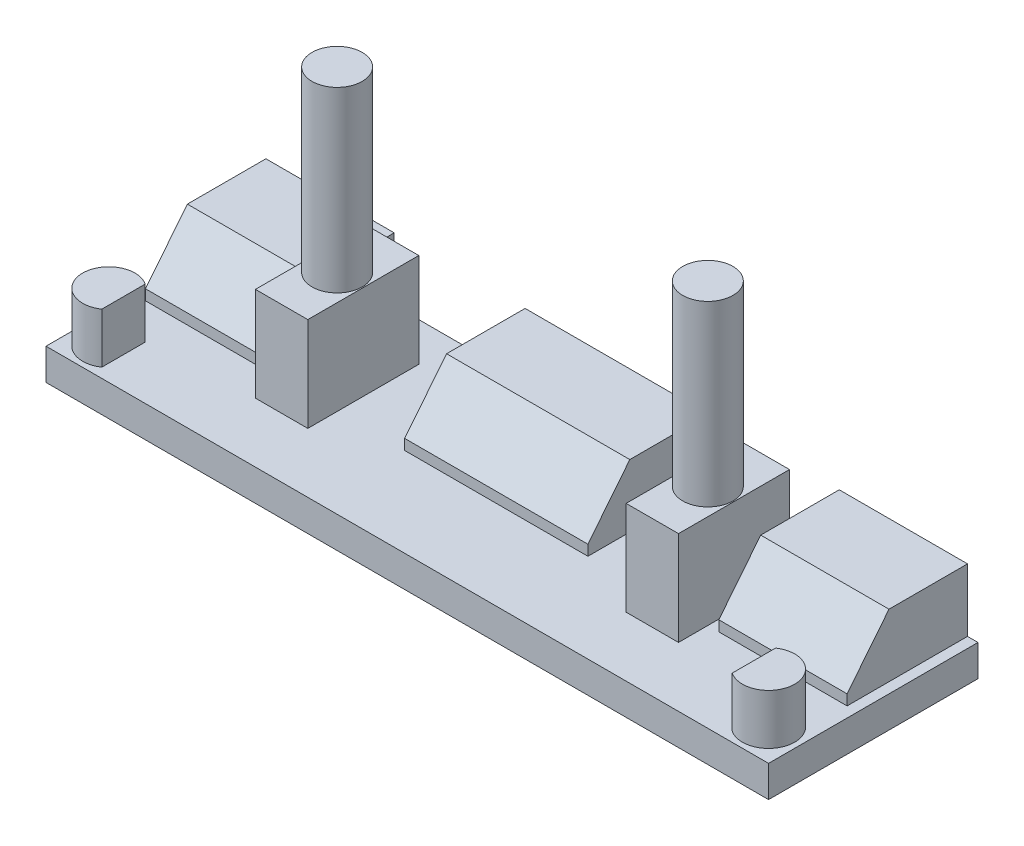
ISO-10303-21;
HEADER;
FILE_DESCRIPTION(('STEP AP214'),'2;1');
FILE_NAME('part.step','',(''),(''),'','','');
FILE_SCHEMA(('AUTOMOTIVE_DESIGN { 1 0 10303 214 1 1 1 1 }'));
ENDSEC;
DATA;
#1=APPLICATION_CONTEXT('core data for automotive mechanical design processes');
#2=APPLICATION_PROTOCOL_DEFINITION('international standard','automotive_design',2000,#1);
#3=PRODUCT_CONTEXT('',#1,'mechanical');
#4=PRODUCT('Part','Part','',(#3));
#5=PRODUCT_RELATED_PRODUCT_CATEGORY('part','',(#4));
#6=PRODUCT_DEFINITION_FORMATION('','',#4);
#7=PRODUCT_DEFINITION_CONTEXT('part definition',#1,'design');
#8=PRODUCT_DEFINITION('design','',#6,#7);
#9=PRODUCT_DEFINITION_SHAPE('','',#8);
#10=(LENGTH_UNIT() NAMED_UNIT(*) SI_UNIT(.MILLI.,.METRE.));
#11=(NAMED_UNIT(*) PLANE_ANGLE_UNIT() SI_UNIT($,.RADIAN.));
#12=(NAMED_UNIT(*) SI_UNIT($,.STERADIAN.) SOLID_ANGLE_UNIT());
#13=UNCERTAINTY_MEASURE_WITH_UNIT(LENGTH_MEASURE(1.E-05),#10,'distance_accuracy_value','');
#14=(GEOMETRIC_REPRESENTATION_CONTEXT(3) GLOBAL_UNCERTAINTY_ASSIGNED_CONTEXT((#13)) GLOBAL_UNIT_ASSIGNED_CONTEXT((#10,
#11,#12)) REPRESENTATION_CONTEXT('',''));
#15=CARTESIAN_POINT('',(0.,0.,0.));
#16=DIRECTION('',(0.,0.,1.));
#17=DIRECTION('',(1.,0.,0.));
#18=AXIS2_PLACEMENT_3D('',#15,#16,#17);
#19=CARTESIAN_POINT('',(0.,3.,0.));
#20=DIRECTION('',(1.,0.,0.));
#21=DIRECTION('',(0.,0.,-1.));
#22=AXIS2_PLACEMENT_3D('',#19,#20,#21);
#23=PLANE('',#22);
#24=DIRECTION('',(0.,0.,1.));
#25=VECTOR('',#24,1.);
#26=CARTESIAN_POINT('',(0.,3.,0.));
#27=LINE('',#26,#25);
#28=CARTESIAN_POINT('',(0.,3.,-20.));
#29=VERTEX_POINT('',#28);
#30=CARTESIAN_POINT('',(0.,3.,0.));
#31=VERTEX_POINT('',#30);
#32=EDGE_CURVE('E509',#29,#31,#27,.T.);
#33=ORIENTED_EDGE('',*,*,#32,.T.);
#34=DIRECTION('',(0.,1.,0.));
#35=VECTOR('',#34,1.);
#36=CARTESIAN_POINT('',(0.,3.,0.));
#37=LINE('',#36,#35);
#38=CARTESIAN_POINT('',(0.,6.,0.));
#39=VERTEX_POINT('',#38);
#40=EDGE_CURVE('E521',#31,#39,#37,.T.);
#41=ORIENTED_EDGE('',*,*,#40,.T.);
#42=DIRECTION('',(0.,0.,1.));
#43=VECTOR('',#42,1.);
#44=CARTESIAN_POINT('',(0.,6.,0.));
#45=LINE('',#44,#43);
#46=CARTESIAN_POINT('',(0.,6.,-20.));
#47=VERTEX_POINT('',#46);
#48=EDGE_CURVE('E508',#47,#39,#45,.T.);
#49=ORIENTED_EDGE('',*,*,#48,.F.);
#50=DIRECTION('',(0.,1.,0.));
#51=VECTOR('',#50,1.);
#52=CARTESIAN_POINT('',(0.,3.,-20.));
#53=LINE('',#52,#51);
#54=EDGE_CURVE('E545',#29,#47,#53,.T.);
#55=ORIENTED_EDGE('',*,*,#54,.F.);
#56=EDGE_LOOP('',(#33,#41,#49,#55));
#57=FACE_BOUND('',#56,.T.);
#58=ADVANCED_FACE('F42',(#57),#23,.F.);
#59=CARTESIAN_POINT('',(0.,3.,0.));
#60=DIRECTION('',(0.,0.,-1.));
#61=DIRECTION('',(-1.,0.,0.));
#62=AXIS2_PLACEMENT_3D('',#59,#60,#61);
#63=PLANE('',#62);
#64=DIRECTION('',(1.,0.,0.));
#65=VECTOR('',#64,1.);
#66=CARTESIAN_POINT('',(0.,3.,0.));
#67=LINE('',#66,#65);
#68=CARTESIAN_POINT('',(69.,3.,0.));
#69=VERTEX_POINT('',#68);
#70=EDGE_CURVE('E519',#31,#69,#67,.T.);
#71=ORIENTED_EDGE('',*,*,#70,.T.);
#72=DIRECTION('',(0.,1.,0.));
#73=VECTOR('',#72,1.);
#74=CARTESIAN_POINT('',(69.,3.,0.));
#75=LINE('',#74,#73);
#76=CARTESIAN_POINT('',(69.,6.,0.));
#77=VERTEX_POINT('',#76);
#78=EDGE_CURVE('E539',#69,#77,#75,.T.);
#79=ORIENTED_EDGE('',*,*,#78,.T.);
#80=DIRECTION('',(1.,0.,0.));
#81=VECTOR('',#80,1.);
#82=CARTESIAN_POINT('',(0.,6.,0.));
#83=LINE('',#82,#81);
#84=EDGE_CURVE('E513',#39,#77,#83,.T.);
#85=ORIENTED_EDGE('',*,*,#84,.F.);
#86=ORIENTED_EDGE('',*,*,#40,.F.);
#87=EDGE_LOOP('',(#71,#79,#85,#86));
#88=FACE_BOUND('',#87,.T.);
#89=ADVANCED_FACE('F620',(#88),#63,.F.);
#90=CARTESIAN_POINT('',(69.,3.,0.));
#91=DIRECTION('',(-1.,0.,0.));
#92=DIRECTION('',(0.,0.,1.));
#93=AXIS2_PLACEMENT_3D('',#90,#91,#92);
#94=PLANE('',#93);
#95=DIRECTION('',(0.,0.,-1.));
#96=VECTOR('',#95,1.);
#97=CARTESIAN_POINT('',(69.,3.,0.));
#98=LINE('',#97,#96);
#99=CARTESIAN_POINT('',(69.,3.,-20.));
#100=VERTEX_POINT('',#99);
#101=EDGE_CURVE('E516',#69,#100,#98,.T.);
#102=ORIENTED_EDGE('',*,*,#101,.T.);
#103=DIRECTION('',(0.,1.,0.));
#104=VECTOR('',#103,1.);
#105=CARTESIAN_POINT('',(69.,3.,-20.));
#106=LINE('',#105,#104);
#107=CARTESIAN_POINT('',(69.,6.,-20.));
#108=VERTEX_POINT('',#107);
#109=EDGE_CURVE('E542',#100,#108,#106,.T.);
#110=ORIENTED_EDGE('',*,*,#109,.T.);
#111=DIRECTION('',(0.,0.,-1.));
#112=VECTOR('',#111,1.);
#113=CARTESIAN_POINT('',(69.,6.,0.));
#114=LINE('',#113,#112);
#115=EDGE_CURVE('E529',#77,#108,#114,.T.);
#116=ORIENTED_EDGE('',*,*,#115,.F.);
#117=ORIENTED_EDGE('',*,*,#78,.F.);
#118=EDGE_LOOP('',(#102,#110,#116,#117));
#119=FACE_BOUND('',#118,.T.);
#120=ADVANCED_FACE('F626',(#119),#94,.F.);
#121=CARTESIAN_POINT('',(0.,3.,-20.));
#122=DIRECTION('',(0.,0.,1.));
#123=DIRECTION('',(1.,0.,0.));
#124=AXIS2_PLACEMENT_3D('',#121,#122,#123);
#125=PLANE('',#124);
#126=DIRECTION('',(-1.,0.,0.));
#127=VECTOR('',#126,1.);
#128=CARTESIAN_POINT('',(0.,3.,-20.));
#129=LINE('',#128,#127);
#130=EDGE_CURVE('E512',#100,#29,#129,.T.);
#131=ORIENTED_EDGE('',*,*,#130,.T.);
#132=ORIENTED_EDGE('',*,*,#54,.T.);
#133=DIRECTION('',(-1.,0.,0.));
#134=VECTOR('',#133,1.);
#135=CARTESIAN_POINT('',(0.,6.,-20.));
#136=LINE('',#135,#134);
#137=CARTESIAN_POINT('',(0.999999999999987,6.,-20.));
#138=VERTEX_POINT('',#137);
#139=EDGE_CURVE('E525',#138,#47,#136,.T.);
#140=ORIENTED_EDGE('',*,*,#139,.F.);
#141=DIRECTION('',(0.,-1.,0.));
#142=VECTOR('',#141,1.);
#143=CARTESIAN_POINT('',(0.999999999999987,12.,-20.));
#144=LINE('',#143,#142);
#145=CARTESIAN_POINT('',(0.999999999999987,12.,-20.));
#146=VERTEX_POINT('',#145);
#147=EDGE_CURVE('E501',#146,#138,#144,.T.);
#148=ORIENTED_EDGE('',*,*,#147,.F.);
#149=DIRECTION('',(1.,0.,0.));
#150=VECTOR('',#149,1.);
#151=CARTESIAN_POINT('',(13.25,12.,-20.));
#152=LINE('',#151,#150);
#153=CARTESIAN_POINT('',(13.25,12.,-20.));
#154=VERTEX_POINT('',#153);
#155=EDGE_CURVE('E477',#146,#154,#152,.T.);
#156=ORIENTED_EDGE('',*,*,#155,.T.);
#157=DIRECTION('',(0.,-1.,0.));
#158=VECTOR('',#157,1.);
#159=CARTESIAN_POINT('',(13.25,12.,-20.));
#160=LINE('',#159,#158);
#161=CARTESIAN_POINT('',(13.25,6.,-20.));
#162=VERTEX_POINT('',#161);
#163=EDGE_CURVE('E504',#154,#162,#160,.T.);
#164=ORIENTED_EDGE('',*,*,#163,.T.);
#165=CARTESIAN_POINT('',(25.75,6.,-20.));
#166=VERTEX_POINT('',#165);
#167=EDGE_CURVE('E607',#166,#162,#136,.T.);
#168=ORIENTED_EDGE('',*,*,#167,.F.);
#169=DIRECTION('',(0.,-1.,0.));
#170=VECTOR('',#169,1.);
#171=CARTESIAN_POINT('',(25.75,12.,-20.));
#172=LINE('',#171,#170);
#173=CARTESIAN_POINT('',(25.75,12.,-20.));
#174=VERTEX_POINT('',#173);
#175=EDGE_CURVE('E464',#174,#166,#172,.T.);
#176=ORIENTED_EDGE('',*,*,#175,.F.);
#177=DIRECTION('',(1.,0.,0.));
#178=VECTOR('',#177,1.);
#179=CARTESIAN_POINT('',(43.25,12.,-20.));
#180=LINE('',#179,#178);
#181=CARTESIAN_POINT('',(43.25,12.,-20.));
#182=VERTEX_POINT('',#181);
#183=EDGE_CURVE('E440',#174,#182,#180,.T.);
#184=ORIENTED_EDGE('',*,*,#183,.T.);
#185=DIRECTION('',(0.,-1.,0.));
#186=VECTOR('',#185,1.);
#187=CARTESIAN_POINT('',(43.25,12.,-20.));
#188=LINE('',#187,#186);
#189=CARTESIAN_POINT('',(43.25,6.,-20.));
#190=VERTEX_POINT('',#189);
#191=EDGE_CURVE('E468',#182,#190,#188,.T.);
#192=ORIENTED_EDGE('',*,*,#191,.T.);
#193=CARTESIAN_POINT('',(55.75,6.,-20.));
#194=VERTEX_POINT('',#193);
#195=EDGE_CURVE('E530',#194,#190,#136,.T.);
#196=ORIENTED_EDGE('',*,*,#195,.F.);
#197=DIRECTION('',(0.,-1.,0.));
#198=VECTOR('',#197,1.);
#199=CARTESIAN_POINT('',(55.75,12.,-20.));
#200=LINE('',#199,#198);
#201=CARTESIAN_POINT('',(55.75,12.,-20.));
#202=VERTEX_POINT('',#201);
#203=EDGE_CURVE('E411',#202,#194,#200,.T.);
#204=ORIENTED_EDGE('',*,*,#203,.F.);
#205=DIRECTION('',(1.,0.,0.));
#206=VECTOR('',#205,1.);
#207=CARTESIAN_POINT('',(55.75,12.,-20.));
#208=LINE('',#207,#206);
#209=CARTESIAN_POINT('',(68.,12.,-20.));
#210=VERTEX_POINT('',#209);
#211=EDGE_CURVE('E407',#202,#210,#208,.T.);
#212=ORIENTED_EDGE('',*,*,#211,.T.);
#213=DIRECTION('',(0.,-1.,0.));
#214=VECTOR('',#213,1.);
#215=CARTESIAN_POINT('',(68.,12.,-20.));
#216=LINE('',#215,#214);
#217=CARTESIAN_POINT('',(68.,6.,-20.));
#218=VERTEX_POINT('',#217);
#219=EDGE_CURVE('E425',#210,#218,#216,.T.);
#220=ORIENTED_EDGE('',*,*,#219,.T.);
#221=EDGE_CURVE('E526',#108,#218,#136,.T.);
#222=ORIENTED_EDGE('',*,*,#221,.F.);
#223=ORIENTED_EDGE('',*,*,#109,.F.);
#224=EDGE_LOOP('',(#131,#132,#140,#148,#156,#164,#168,#176,#184,#192,#196,#204,#212,#220,#222,#223));
#225=FACE_BOUND('',#224,.T.);
#226=ADVANCED_FACE('F612',(#225),#125,.F.);
#227=CARTESIAN_POINT('',(0.,6.,0.));
#228=DIRECTION('',(0.,1.,0.));
#229=DIRECTION('',(0.,0.,-1.));
#230=AXIS2_PLACEMENT_3D('',#227,#228,#229);
#231=PLANE('',#230);
#232=DIRECTION('',(0.,0.,-1.));
#233=VECTOR('',#232,1.);
#234=CARTESIAN_POINT('',(64.6,6.,0.));
#235=LINE('',#234,#233);
#236=CARTESIAN_POINT('',(64.6,6.,-0.928768482279194));
#237=VERTEX_POINT('',#236);
#238=CARTESIAN_POINT('',(64.6,6.,-5.07123151772079));
#239=VERTEX_POINT('',#238);
#240=EDGE_CURVE('E254',#237,#239,#235,.T.);
#241=ORIENTED_EDGE('',*,*,#240,.T.);
#242=CARTESIAN_POINT('',(66.,6.,-2.99999999999999));
#243=DIRECTION('',(0.,-1.,0.));
#244=DIRECTION('',(0.,0.,-1.));
#245=AXIS2_PLACEMENT_3D('',#242,#243,#244);
#246=CIRCLE('',#245,2.5);
#247=EDGE_CURVE('E58',#239,#237,#246,.T.);
#248=ORIENTED_EDGE('',*,*,#247,.T.);
#249=EDGE_LOOP('',(#241,#248));
#250=FACE_BOUND('',#249,.T.);
#251=DIRECTION('',(-1.,0.,0.));
#252=VECTOR('',#251,1.);
#253=CARTESIAN_POINT('',(19.3,6.,-5.70000000000001));
#254=LINE('',#253,#252);
#255=CARTESIAN_POINT('',(19.3,6.,-5.70000000000001));
#256=VERTEX_POINT('',#255);
#257=CARTESIAN_POINT('',(14.3,6.,-5.70000000000002));
#258=VERTEX_POINT('',#257);
#259=EDGE_CURVE('E307',#256,#258,#254,.T.);
#260=ORIENTED_EDGE('',*,*,#259,.T.);
#261=DIRECTION('',(0.,0.,-1.));
#262=VECTOR('',#261,1.);
#263=CARTESIAN_POINT('',(14.3,6.,-5.70000000000002));
#264=LINE('',#263,#262);
#265=CARTESIAN_POINT('',(14.3,6.,-16.3));
#266=VERTEX_POINT('',#265);
#267=EDGE_CURVE('E316',#258,#266,#264,.T.);
#268=ORIENTED_EDGE('',*,*,#267,.T.);
#269=DIRECTION('',(1.,0.,0.));
#270=VECTOR('',#269,1.);
#271=CARTESIAN_POINT('',(19.3,6.,-16.3));
#272=LINE('',#271,#270);
#273=CARTESIAN_POINT('',(19.3,6.,-16.3));
#274=VERTEX_POINT('',#273);
#275=EDGE_CURVE('E334',#266,#274,#272,.T.);
#276=ORIENTED_EDGE('',*,*,#275,.T.);
#277=DIRECTION('',(0.,0.,1.));
#278=VECTOR('',#277,1.);
#279=CARTESIAN_POINT('',(19.3,6.,-5.70000000000001));
#280=LINE('',#279,#278);
#281=EDGE_CURVE('E331',#274,#256,#280,.T.);
#282=ORIENTED_EDGE('',*,*,#281,.T.);
#283=EDGE_LOOP('',(#260,#268,#276,#282));
#284=FACE_BOUND('',#283,.T.);
#285=DIRECTION('',(0.,0.,-1.));
#286=VECTOR('',#285,1.);
#287=CARTESIAN_POINT('',(49.7,6.,-5.7));
#288=LINE('',#287,#286);
#289=CARTESIAN_POINT('',(49.7,6.,-5.7));
#290=VERTEX_POINT('',#289);
#291=CARTESIAN_POINT('',(49.7,6.,-16.3));
#292=VERTEX_POINT('',#291);
#293=EDGE_CURVE('E354',#290,#292,#288,.T.);
#294=ORIENTED_EDGE('',*,*,#293,.T.);
#295=DIRECTION('',(1.,0.,0.));
#296=VECTOR('',#295,1.);
#297=CARTESIAN_POINT('',(49.7,6.,-16.3));
#298=LINE('',#297,#296);
#299=CARTESIAN_POINT('',(54.7,6.,-16.3));
#300=VERTEX_POINT('',#299);
#301=EDGE_CURVE('E360',#292,#300,#298,.T.);
#302=ORIENTED_EDGE('',*,*,#301,.T.);
#303=DIRECTION('',(0.,0.,1.));
#304=VECTOR('',#303,1.);
#305=CARTESIAN_POINT('',(54.7,6.,-5.7));
#306=LINE('',#305,#304);
#307=CARTESIAN_POINT('',(54.7,6.,-5.7));
#308=VERTEX_POINT('',#307);
#309=EDGE_CURVE('E378',#300,#308,#306,.T.);
#310=ORIENTED_EDGE('',*,*,#309,.T.);
#311=DIRECTION('',(-1.,0.,0.));
#312=VECTOR('',#311,1.);
#313=CARTESIAN_POINT('',(49.7,6.,-5.7));
#314=LINE('',#313,#312);
#315=EDGE_CURVE('E375',#308,#290,#314,.T.);
#316=ORIENTED_EDGE('',*,*,#315,.T.);
#317=EDGE_LOOP('',(#294,#302,#310,#316));
#318=FACE_BOUND('',#317,.T.);
#319=DIRECTION('',(0.,0.,-1.));
#320=VECTOR('',#319,1.);
#321=CARTESIAN_POINT('',(55.75,6.,-20.));
#322=LINE('',#321,#320);
#323=CARTESIAN_POINT('',(55.75,6.,-8.5));
#324=VERTEX_POINT('',#323);
#325=EDGE_CURVE('E398',#324,#194,#322,.T.);
#326=ORIENTED_EDGE('',*,*,#325,.T.);
#327=ORIENTED_EDGE('',*,*,#195,.T.);
#328=DIRECTION('',(0.,0.,1.));
#329=VECTOR('',#328,1.);
#330=CARTESIAN_POINT('',(43.25,6.,-20.));
#331=LINE('',#330,#329);
#332=CARTESIAN_POINT('',(43.25,6.,-8.5));
#333=VERTEX_POINT('',#332);
#334=EDGE_CURVE('E435',#190,#333,#331,.T.);
#335=ORIENTED_EDGE('',*,*,#334,.T.);
#336=DIRECTION('',(-1.,0.,0.));
#337=VECTOR('',#336,1.);
#338=CARTESIAN_POINT('',(43.25,6.,-8.5));
#339=LINE('',#338,#337);
#340=CARTESIAN_POINT('',(25.75,6.,-8.50000000000001));
#341=VERTEX_POINT('',#340);
#342=EDGE_CURVE('E441',#333,#341,#339,.T.);
#343=ORIENTED_EDGE('',*,*,#342,.T.);
#344=DIRECTION('',(0.,0.,-1.));
#345=VECTOR('',#344,1.);
#346=CARTESIAN_POINT('',(25.75,6.,-20.));
#347=LINE('',#346,#345);
#348=EDGE_CURVE('E452',#341,#166,#347,.T.);
#349=ORIENTED_EDGE('',*,*,#348,.T.);
#350=ORIENTED_EDGE('',*,*,#167,.T.);
#351=DIRECTION('',(0.,0.,1.));
#352=VECTOR('',#351,1.);
#353=CARTESIAN_POINT('',(13.25,6.,-20.));
#354=LINE('',#353,#352);
#355=CARTESIAN_POINT('',(13.25,6.,-8.50000000000001));
#356=VERTEX_POINT('',#355);
#357=EDGE_CURVE('E472',#162,#356,#354,.T.);
#358=ORIENTED_EDGE('',*,*,#357,.T.);
#359=DIRECTION('',(-1.,0.,0.));
#360=VECTOR('',#359,1.);
#361=CARTESIAN_POINT('',(13.25,6.,-8.50000000000001));
#362=LINE('',#361,#360);
#363=CARTESIAN_POINT('',(0.999999999999987,6.,-8.50000000000001));
#364=VERTEX_POINT('',#363);
#365=EDGE_CURVE('E478',#356,#364,#362,.T.);
#366=ORIENTED_EDGE('',*,*,#365,.T.);
#367=DIRECTION('',(0.,0.,-1.));
#368=VECTOR('',#367,1.);
#369=CARTESIAN_POINT('',(0.999999999999987,6.,-20.));
#370=LINE('',#369,#368);
#371=EDGE_CURVE('E489',#364,#138,#370,.T.);
#372=ORIENTED_EDGE('',*,*,#371,.T.);
#373=ORIENTED_EDGE('',*,*,#139,.T.);
#374=ORIENTED_EDGE('',*,*,#48,.T.);
#375=ORIENTED_EDGE('',*,*,#84,.T.);
#376=ORIENTED_EDGE('',*,*,#115,.T.);
#377=ORIENTED_EDGE('',*,*,#221,.T.);
#378=DIRECTION('',(0.,0.,1.));
#379=VECTOR('',#378,1.);
#380=CARTESIAN_POINT('',(68.,6.,-20.));
#381=LINE('',#380,#379);
#382=CARTESIAN_POINT('',(68.,6.,-8.5));
#383=VERTEX_POINT('',#382);
#384=EDGE_CURVE('E403',#218,#383,#381,.T.);
#385=ORIENTED_EDGE('',*,*,#384,.T.);
#386=DIRECTION('',(-1.,0.,0.));
#387=VECTOR('',#386,1.);
#388=CARTESIAN_POINT('',(55.75,6.,-8.5));
#389=LINE('',#388,#387);
#390=EDGE_CURVE('E415',#383,#324,#389,.T.);
#391=ORIENTED_EDGE('',*,*,#390,.T.);
#392=EDGE_LOOP('',(#326,#327,#335,#343,#349,#350,#358,#366,#372,#373,#374,#375,#376,#377,#385,#391));
#393=FACE_BOUND('',#392,.T.);
#394=DIRECTION('',(0.,0.,-1.));
#395=VECTOR('',#394,1.);
#396=CARTESIAN_POINT('',(4.4,6.,0.));
#397=LINE('',#396,#395);
#398=CARTESIAN_POINT('',(4.4,6.,-0.928768482279238));
#399=VERTEX_POINT('',#398);
#400=CARTESIAN_POINT('',(4.40000000000001,6.,-5.07123151772084));
#401=VERTEX_POINT('',#400);
#402=EDGE_CURVE('E281',#399,#401,#397,.T.);
#403=ORIENTED_EDGE('',*,*,#402,.F.);
#404=CARTESIAN_POINT('',(3.,6.,-3.00000000000004));
#405=DIRECTION('',(0.,-1.,0.));
#406=DIRECTION('',(0.,0.,-1.));
#407=AXIS2_PLACEMENT_3D('',#404,#405,#406);
#408=CIRCLE('',#407,2.49999999999999);
#409=EDGE_CURVE('E66',#401,#399,#408,.F.);
#410=ORIENTED_EDGE('',*,*,#409,.F.);
#411=EDGE_LOOP('',(#403,#410));
#412=FACE_BOUND('',#411,.T.);
#413=ADVANCED_FACE('F605',(#250,#284,#318,#393,#412),#231,.T.);
#414=CARTESIAN_POINT('',(0.,3.,0.));
#415=DIRECTION('',(0.,1.,0.));
#416=DIRECTION('',(0.,0.,-1.));
#417=AXIS2_PLACEMENT_3D('',#414,#415,#416);
#418=PLANE('',#417);
#419=ORIENTED_EDGE('',*,*,#101,.F.);
#420=ORIENTED_EDGE('',*,*,#70,.F.);
#421=ORIENTED_EDGE('',*,*,#32,.F.);
#422=ORIENTED_EDGE('',*,*,#130,.F.);
#423=EDGE_LOOP('',(#419,#420,#421,#422));
#424=FACE_BOUND('',#423,.T.);
#425=ADVANCED_FACE('F725',(#424),#418,.F.);
#426=CARTESIAN_POINT('',(13.25,12.,-20.));
#427=DIRECTION('',(1.,0.,0.));
#428=DIRECTION('',(0.,0.,-1.));
#429=AXIS2_PLACEMENT_3D('',#426,#427,#428);
#430=PLANE('',#429);
#431=DIRECTION('',(0.,0.,1.));
#432=VECTOR('',#431,1.);
#433=CARTESIAN_POINT('',(13.25,12.,-20.));
#434=LINE('',#433,#432);
#435=CARTESIAN_POINT('',(13.25,12.,-12.5));
#436=VERTEX_POINT('',#435);
#437=EDGE_CURVE('E473',#154,#436,#434,.T.);
#438=ORIENTED_EDGE('',*,*,#437,.T.);
#439=DIRECTION('',(0.,0.780868809443031,-0.624695047554424));
#440=VECTOR('',#439,1.);
#441=CARTESIAN_POINT('',(13.25,15.6585365853658,-15.4268292682927));
#442=LINE('',#441,#440);
#443=CARTESIAN_POINT('',(13.25,6.99999999999998,-8.50000000000001));
#444=VERTEX_POINT('',#443);
#445=EDGE_CURVE('E11',#436,#444,#442,.F.);
#446=ORIENTED_EDGE('',*,*,#445,.T.);
#447=DIRECTION('',(0.,-1.,0.));
#448=VECTOR('',#447,1.);
#449=CARTESIAN_POINT('',(13.25,12.,-8.50000000000001));
#450=LINE('',#449,#448);
#451=EDGE_CURVE('E485',#444,#356,#450,.T.);
#452=ORIENTED_EDGE('',*,*,#451,.T.);
#453=ORIENTED_EDGE('',*,*,#357,.F.);
#454=ORIENTED_EDGE('',*,*,#163,.F.);
#455=EDGE_LOOP('',(#438,#446,#452,#453,#454));
#456=FACE_BOUND('',#455,.T.);
#457=ADVANCED_FACE('F591',(#456),#430,.T.);
#458=CARTESIAN_POINT('',(0.999999999999987,12.,-20.));
#459=DIRECTION('',(-1.,0.,0.));
#460=DIRECTION('',(0.,0.,1.));
#461=AXIS2_PLACEMENT_3D('',#458,#459,#460);
#462=PLANE('',#461);
#463=DIRECTION('',(0.,-1.,0.));
#464=VECTOR('',#463,1.);
#465=CARTESIAN_POINT('',(0.999999999999987,12.,-8.50000000000001));
#466=LINE('',#465,#464);
#467=CARTESIAN_POINT('',(0.999999999999987,6.99999999999998,-8.50000000000001));
#468=VERTEX_POINT('',#467);
#469=EDGE_CURVE('E498',#468,#364,#466,.T.);
#470=ORIENTED_EDGE('',*,*,#469,.F.);
#471=DIRECTION('',(0.,-0.780868809443031,0.624695047554424));
#472=VECTOR('',#471,1.);
#473=CARTESIAN_POINT('',(0.999999999999987,15.6585365853658,-15.4268292682927));
#474=LINE('',#473,#472);
#475=CARTESIAN_POINT('',(0.999999999999987,12.,-12.5));
#476=VERTEX_POINT('',#475);
#477=EDGE_CURVE('E579',#468,#476,#474,.F.);
#478=ORIENTED_EDGE('',*,*,#477,.T.);
#479=DIRECTION('',(0.,0.,-1.));
#480=VECTOR('',#479,1.);
#481=CARTESIAN_POINT('',(0.999999999999987,12.,-20.));
#482=LINE('',#481,#480);
#483=EDGE_CURVE('E482',#476,#146,#482,.T.);
#484=ORIENTED_EDGE('',*,*,#483,.T.);
#485=ORIENTED_EDGE('',*,*,#147,.T.);
#486=ORIENTED_EDGE('',*,*,#371,.F.);
#487=EDGE_LOOP('',(#470,#478,#484,#485,#486));
#488=FACE_BOUND('',#487,.T.);
#489=ADVANCED_FACE('F601',(#488),#462,.T.);
#490=CARTESIAN_POINT('',(13.25,12.,-8.50000000000001));
#491=DIRECTION('',(0.,0.,1.));
#492=DIRECTION('',(1.,0.,0.));
#493=AXIS2_PLACEMENT_3D('',#490,#491,#492);
#494=PLANE('',#493);
#495=ORIENTED_EDGE('',*,*,#451,.F.);
#496=DIRECTION('',(-1.,0.,0.));
#497=VECTOR('',#496,1.);
#498=CARTESIAN_POINT('',(13.25,6.99999999999998,-8.50000000000001));
#499=LINE('',#498,#497);
#500=EDGE_CURVE('E575',#444,#468,#499,.T.);
#501=ORIENTED_EDGE('',*,*,#500,.T.);
#502=ORIENTED_EDGE('',*,*,#469,.T.);
#503=ORIENTED_EDGE('',*,*,#365,.F.);
#504=EDGE_LOOP('',(#495,#501,#502,#503));
#505=FACE_BOUND('',#504,.T.);
#506=ADVANCED_FACE('F597',(#505),#494,.T.);
#507=CARTESIAN_POINT('',(0.,12.,0.));
#508=DIRECTION('',(0.,1.,0.));
#509=DIRECTION('',(0.,0.,-1.));
#510=AXIS2_PLACEMENT_3D('',#507,#508,#509);
#511=PLANE('',#510);
#512=ORIENTED_EDGE('',*,*,#483,.F.);
#513=DIRECTION('',(1.,0.,0.));
#514=VECTOR('',#513,1.);
#515=CARTESIAN_POINT('',(0.,12.,-12.5));
#516=LINE('',#515,#514);
#517=EDGE_CURVE('E52',#476,#436,#516,.T.);
#518=ORIENTED_EDGE('',*,*,#517,.T.);
#519=ORIENTED_EDGE('',*,*,#437,.F.);
#520=ORIENTED_EDGE('',*,*,#155,.F.);
#521=EDGE_LOOP('',(#512,#518,#519,#520));
#522=FACE_BOUND('',#521,.T.);
#523=ADVANCED_FACE('F586',(#522),#511,.T.);
#524=CARTESIAN_POINT('',(43.25,12.,-20.));
#525=DIRECTION('',(1.,0.,0.));
#526=DIRECTION('',(0.,0.,-1.));
#527=AXIS2_PLACEMENT_3D('',#524,#525,#526);
#528=PLANE('',#527);
#529=DIRECTION('',(0.,0.,1.));
#530=VECTOR('',#529,1.);
#531=CARTESIAN_POINT('',(43.25,12.,-20.));
#532=LINE('',#531,#530);
#533=CARTESIAN_POINT('',(43.25,12.,-12.5));
#534=VERTEX_POINT('',#533);
#535=EDGE_CURVE('E436',#182,#534,#532,.T.);
#536=ORIENTED_EDGE('',*,*,#535,.T.);
#537=DIRECTION('',(0.,0.780868809443031,-0.624695047554424));
#538=VECTOR('',#537,1.);
#539=CARTESIAN_POINT('',(43.25,15.6585365853658,-15.4268292682927));
#540=LINE('',#539,#538);
#541=CARTESIAN_POINT('',(43.25,6.99999999999998,-8.5));
#542=VERTEX_POINT('',#541);
#543=EDGE_CURVE('E572',#534,#542,#540,.F.);
#544=ORIENTED_EDGE('',*,*,#543,.T.);
#545=DIRECTION('',(0.,-1.,0.));
#546=VECTOR('',#545,1.);
#547=CARTESIAN_POINT('',(43.25,12.,-8.5));
#548=LINE('',#547,#546);
#549=EDGE_CURVE('E448',#542,#333,#548,.T.);
#550=ORIENTED_EDGE('',*,*,#549,.T.);
#551=ORIENTED_EDGE('',*,*,#334,.F.);
#552=ORIENTED_EDGE('',*,*,#191,.F.);
#553=EDGE_LOOP('',(#536,#544,#550,#551,#552));
#554=FACE_BOUND('',#553,.T.);
#555=ADVANCED_FACE('F690',(#554),#528,.T.);
#556=CARTESIAN_POINT('',(25.75,12.,-20.));
#557=DIRECTION('',(-1.,0.,0.));
#558=DIRECTION('',(0.,0.,1.));
#559=AXIS2_PLACEMENT_3D('',#556,#557,#558);
#560=PLANE('',#559);
#561=DIRECTION('',(0.,-1.,0.));
#562=VECTOR('',#561,1.);
#563=CARTESIAN_POINT('',(25.75,12.,-8.50000000000001));
#564=LINE('',#563,#562);
#565=CARTESIAN_POINT('',(25.75,6.99999999999998,-8.50000000000001));
#566=VERTEX_POINT('',#565);
#567=EDGE_CURVE('E461',#566,#341,#564,.T.);
#568=ORIENTED_EDGE('',*,*,#567,.F.);
#569=DIRECTION('',(0.,-0.780868809443031,0.624695047554424));
#570=VECTOR('',#569,1.);
#571=CARTESIAN_POINT('',(25.75,15.6585365853658,-15.4268292682927));
#572=LINE('',#571,#570);
#573=CARTESIAN_POINT('',(25.75,12.,-12.5));
#574=VERTEX_POINT('',#573);
#575=EDGE_CURVE('E566',#566,#574,#572,.F.);
#576=ORIENTED_EDGE('',*,*,#575,.T.);
#577=DIRECTION('',(0.,0.,-1.));
#578=VECTOR('',#577,1.);
#579=CARTESIAN_POINT('',(25.75,12.,-20.));
#580=LINE('',#579,#578);
#581=EDGE_CURVE('E445',#574,#174,#580,.T.);
#582=ORIENTED_EDGE('',*,*,#581,.T.);
#583=ORIENTED_EDGE('',*,*,#175,.T.);
#584=ORIENTED_EDGE('',*,*,#348,.F.);
#585=EDGE_LOOP('',(#568,#576,#582,#583,#584));
#586=FACE_BOUND('',#585,.T.);
#587=ADVANCED_FACE('F698',(#586),#560,.T.);
#588=CARTESIAN_POINT('',(43.25,12.,-8.5));
#589=DIRECTION('',(0.,0.,1.));
#590=DIRECTION('',(1.,0.,0.));
#591=AXIS2_PLACEMENT_3D('',#588,#589,#590);
#592=PLANE('',#591);
#593=ORIENTED_EDGE('',*,*,#549,.F.);
#594=DIRECTION('',(-1.,0.,0.));
#595=VECTOR('',#594,1.);
#596=CARTESIAN_POINT('',(43.25,6.99999999999998,-8.5));
#597=LINE('',#596,#595);
#598=EDGE_CURVE('E562',#542,#566,#597,.T.);
#599=ORIENTED_EDGE('',*,*,#598,.T.);
#600=ORIENTED_EDGE('',*,*,#567,.T.);
#601=ORIENTED_EDGE('',*,*,#342,.F.);
#602=EDGE_LOOP('',(#593,#599,#600,#601));
#603=FACE_BOUND('',#602,.T.);
#604=ADVANCED_FACE('F695',(#603),#592,.T.);
#605=CARTESIAN_POINT('',(0.,12.,0.));
#606=DIRECTION('',(0.,1.,0.));
#607=DIRECTION('',(0.,0.,-1.));
#608=AXIS2_PLACEMENT_3D('',#605,#606,#607);
#609=PLANE('',#608);
#610=ORIENTED_EDGE('',*,*,#581,.F.);
#611=DIRECTION('',(1.,0.,0.));
#612=VECTOR('',#611,1.);
#613=CARTESIAN_POINT('',(0.,12.,-12.5));
#614=LINE('',#613,#612);
#615=EDGE_CURVE('E569',#574,#534,#614,.T.);
#616=ORIENTED_EDGE('',*,*,#615,.T.);
#617=ORIENTED_EDGE('',*,*,#535,.F.);
#618=ORIENTED_EDGE('',*,*,#183,.F.);
#619=EDGE_LOOP('',(#610,#616,#617,#618));
#620=FACE_BOUND('',#619,.T.);
#621=ADVANCED_FACE('F702',(#620),#609,.T.);
#622=CARTESIAN_POINT('',(55.75,12.,-20.));
#623=DIRECTION('',(-1.,0.,0.));
#624=DIRECTION('',(0.,0.,1.));
#625=AXIS2_PLACEMENT_3D('',#622,#623,#624);
#626=PLANE('',#625);
#627=DIRECTION('',(0.,-1.,0.));
#628=VECTOR('',#627,1.);
#629=CARTESIAN_POINT('',(55.75,12.,-8.5));
#630=LINE('',#629,#628);
#631=CARTESIAN_POINT('',(55.75,6.99999999999998,-8.5));
#632=VERTEX_POINT('',#631);
#633=EDGE_CURVE('E432',#632,#324,#630,.T.);
#634=ORIENTED_EDGE('',*,*,#633,.F.);
#635=DIRECTION('',(0.,0.780868809443031,-0.624695047554424));
#636=VECTOR('',#635,1.);
#637=CARTESIAN_POINT('',(55.75,15.6585365853658,-15.4268292682927));
#638=LINE('',#637,#636);
#639=CARTESIAN_POINT('',(55.75,12.,-12.5));
#640=VERTEX_POINT('',#639);
#641=EDGE_CURVE('E553',#632,#640,#638,.T.);
#642=ORIENTED_EDGE('',*,*,#641,.T.);
#643=DIRECTION('',(0.,0.,-1.));
#644=VECTOR('',#643,1.);
#645=CARTESIAN_POINT('',(55.75,12.,-20.));
#646=LINE('',#645,#644);
#647=EDGE_CURVE('E399',#640,#202,#646,.T.);
#648=ORIENTED_EDGE('',*,*,#647,.T.);
#649=ORIENTED_EDGE('',*,*,#203,.T.);
#650=ORIENTED_EDGE('',*,*,#325,.F.);
#651=EDGE_LOOP('',(#634,#642,#648,#649,#650));
#652=FACE_BOUND('',#651,.T.);
#653=ADVANCED_FACE('F647',(#652),#626,.T.);
#654=CARTESIAN_POINT('',(55.75,12.,-8.5));
#655=DIRECTION('',(0.,0.,1.));
#656=DIRECTION('',(1.,0.,0.));
#657=AXIS2_PLACEMENT_3D('',#654,#655,#656);
#658=PLANE('',#657);
#659=DIRECTION('',(0.,-1.,0.));
#660=VECTOR('',#659,1.);
#661=CARTESIAN_POINT('',(68.,12.,-8.5));
#662=LINE('',#661,#660);
#663=CARTESIAN_POINT('',(68.,6.99999999999998,-8.5));
#664=VERTEX_POINT('',#663);
#665=EDGE_CURVE('E429',#664,#383,#662,.T.);
#666=ORIENTED_EDGE('',*,*,#665,.F.);
#667=DIRECTION('',(-1.,0.,0.));
#668=VECTOR('',#667,1.);
#669=CARTESIAN_POINT('',(55.75,6.99999999999998,-8.5));
#670=LINE('',#669,#668);
#671=EDGE_CURVE('E549',#664,#632,#670,.T.);
#672=ORIENTED_EDGE('',*,*,#671,.T.);
#673=ORIENTED_EDGE('',*,*,#633,.T.);
#674=ORIENTED_EDGE('',*,*,#390,.F.);
#675=EDGE_LOOP('',(#666,#672,#673,#674));
#676=FACE_BOUND('',#675,.T.);
#677=ADVANCED_FACE('F640',(#676),#658,.T.);
#678=CARTESIAN_POINT('',(68.,12.,-20.));
#679=DIRECTION('',(1.,0.,0.));
#680=DIRECTION('',(0.,0.,-1.));
#681=AXIS2_PLACEMENT_3D('',#678,#679,#680);
#682=PLANE('',#681);
#683=DIRECTION('',(0.,0.,1.));
#684=VECTOR('',#683,1.);
#685=CARTESIAN_POINT('',(68.,12.,-20.));
#686=LINE('',#685,#684);
#687=CARTESIAN_POINT('',(68.,12.,-12.5));
#688=VERTEX_POINT('',#687);
#689=EDGE_CURVE('E402',#210,#688,#686,.T.);
#690=ORIENTED_EDGE('',*,*,#689,.T.);
#691=DIRECTION('',(0.,-0.780868809443031,0.624695047554424));
#692=VECTOR('',#691,1.);
#693=CARTESIAN_POINT('',(68.,15.6585365853658,-15.4268292682927));
#694=LINE('',#693,#692);
#695=EDGE_CURVE('E559',#688,#664,#694,.T.);
#696=ORIENTED_EDGE('',*,*,#695,.T.);
#697=ORIENTED_EDGE('',*,*,#665,.T.);
#698=ORIENTED_EDGE('',*,*,#384,.F.);
#699=ORIENTED_EDGE('',*,*,#219,.F.);
#700=EDGE_LOOP('',(#690,#696,#697,#698,#699));
#701=FACE_BOUND('',#700,.T.);
#702=ADVANCED_FACE('F635',(#701),#682,.T.);
#703=CARTESIAN_POINT('',(0.,12.,0.));
#704=DIRECTION('',(0.,-1.,0.));
#705=DIRECTION('',(0.,0.,1.));
#706=AXIS2_PLACEMENT_3D('',#703,#704,#705);
#707=PLANE('',#706);
#708=ORIENTED_EDGE('',*,*,#647,.F.);
#709=DIRECTION('',(1.,0.,0.));
#710=VECTOR('',#709,1.);
#711=CARTESIAN_POINT('',(68.,12.,-12.5));
#712=LINE('',#711,#710);
#713=EDGE_CURVE('E556',#640,#688,#712,.T.);
#714=ORIENTED_EDGE('',*,*,#713,.T.);
#715=ORIENTED_EDGE('',*,*,#689,.F.);
#716=ORIENTED_EDGE('',*,*,#211,.F.);
#717=EDGE_LOOP('',(#708,#714,#715,#716));
#718=FACE_BOUND('',#717,.T.);
#719=ADVANCED_FACE('F650',(#718),#707,.F.);
#720=CARTESIAN_POINT('',(49.7,15.,-5.7));
#721=DIRECTION('',(-1.,0.,0.));
#722=DIRECTION('',(0.,0.,1.));
#723=AXIS2_PLACEMENT_3D('',#720,#721,#722);
#724=PLANE('',#723);
#725=ORIENTED_EDGE('',*,*,#293,.F.);
#726=DIRECTION('',(0.,-1.,0.));
#727=VECTOR('',#726,1.);
#728=CARTESIAN_POINT('',(49.7,15.,-5.7));
#729=LINE('',#728,#727);
#730=CARTESIAN_POINT('',(49.7,15.,-5.7));
#731=VERTEX_POINT('',#730);
#732=EDGE_CURVE('E394',#731,#290,#729,.T.);
#733=ORIENTED_EDGE('',*,*,#732,.F.);
#734=DIRECTION('',(0.,0.,-1.));
#735=VECTOR('',#734,1.);
#736=CARTESIAN_POINT('',(49.7,15.,-5.7));
#737=LINE('',#736,#735);
#738=CARTESIAN_POINT('',(49.7,15.,-16.3));
#739=VERTEX_POINT('',#738);
#740=EDGE_CURVE('E355',#731,#739,#737,.T.);
#741=ORIENTED_EDGE('',*,*,#740,.T.);
#742=DIRECTION('',(0.,-1.,0.));
#743=VECTOR('',#742,1.);
#744=CARTESIAN_POINT('',(49.7,15.,-16.3));
#745=LINE('',#744,#743);
#746=EDGE_CURVE('E372',#739,#292,#745,.T.);
#747=ORIENTED_EDGE('',*,*,#746,.T.);
#748=EDGE_LOOP('',(#725,#733,#741,#747));
#749=FACE_BOUND('',#748,.T.);
#750=ADVANCED_FACE('F652',(#749),#724,.T.);
#751=CARTESIAN_POINT('',(49.7,15.,-5.7));
#752=DIRECTION('',(0.,0.,1.));
#753=DIRECTION('',(1.,0.,0.));
#754=AXIS2_PLACEMENT_3D('',#751,#752,#753);
#755=PLANE('',#754);
#756=ORIENTED_EDGE('',*,*,#315,.F.);
#757=DIRECTION('',(0.,-1.,0.));
#758=VECTOR('',#757,1.);
#759=CARTESIAN_POINT('',(54.7,15.,-5.7));
#760=LINE('',#759,#758);
#761=CARTESIAN_POINT('',(54.7,15.,-5.7));
#762=VERTEX_POINT('',#761);
#763=EDGE_CURVE('E390',#762,#308,#760,.T.);
#764=ORIENTED_EDGE('',*,*,#763,.F.);
#765=DIRECTION('',(-1.,0.,0.));
#766=VECTOR('',#765,1.);
#767=CARTESIAN_POINT('',(49.7,15.,-5.7));
#768=LINE('',#767,#766);
#769=EDGE_CURVE('E359',#762,#731,#768,.T.);
#770=ORIENTED_EDGE('',*,*,#769,.T.);
#771=ORIENTED_EDGE('',*,*,#732,.T.);
#772=EDGE_LOOP('',(#756,#764,#770,#771));
#773=FACE_BOUND('',#772,.T.);
#774=ADVANCED_FACE('F658',(#773),#755,.T.);
#775=CARTESIAN_POINT('',(54.7,15.,-5.7));
#776=DIRECTION('',(1.,0.,0.));
#777=DIRECTION('',(0.,0.,-1.));
#778=AXIS2_PLACEMENT_3D('',#775,#776,#777);
#779=PLANE('',#778);
#780=ORIENTED_EDGE('',*,*,#309,.F.);
#781=DIRECTION('',(0.,-1.,0.));
#782=VECTOR('',#781,1.);
#783=CARTESIAN_POINT('',(54.7,15.,-16.3));
#784=LINE('',#783,#782);
#785=CARTESIAN_POINT('',(54.7,15.,-16.3));
#786=VERTEX_POINT('',#785);
#787=EDGE_CURVE('E386',#786,#300,#784,.T.);
#788=ORIENTED_EDGE('',*,*,#787,.F.);
#789=DIRECTION('',(0.,0.,1.));
#790=VECTOR('',#789,1.);
#791=CARTESIAN_POINT('',(54.7,15.,-5.7));
#792=LINE('',#791,#790);
#793=EDGE_CURVE('E364',#786,#762,#792,.T.);
#794=ORIENTED_EDGE('',*,*,#793,.T.);
#795=ORIENTED_EDGE('',*,*,#763,.T.);
#796=EDGE_LOOP('',(#780,#788,#794,#795));
#797=FACE_BOUND('',#796,.T.);
#798=ADVANCED_FACE('F801',(#797),#779,.T.);
#799=CARTESIAN_POINT('',(49.7,15.,-16.3));
#800=DIRECTION('',(0.,0.,-1.));
#801=DIRECTION('',(-1.,0.,0.));
#802=AXIS2_PLACEMENT_3D('',#799,#800,#801);
#803=PLANE('',#802);
#804=ORIENTED_EDGE('',*,*,#301,.F.);
#805=ORIENTED_EDGE('',*,*,#746,.F.);
#806=DIRECTION('',(1.,0.,0.));
#807=VECTOR('',#806,1.);
#808=CARTESIAN_POINT('',(49.7,15.,-16.3));
#809=LINE('',#808,#807);
#810=EDGE_CURVE('E368',#739,#786,#809,.T.);
#811=ORIENTED_EDGE('',*,*,#810,.T.);
#812=ORIENTED_EDGE('',*,*,#787,.T.);
#813=EDGE_LOOP('',(#804,#805,#811,#812));
#814=FACE_BOUND('',#813,.T.);
#815=ADVANCED_FACE('F810',(#814),#803,.T.);
#816=CARTESIAN_POINT('',(0.,15.,0.));
#817=DIRECTION('',(0.,1.,0.));
#818=DIRECTION('',(0.,0.,-1.));
#819=AXIS2_PLACEMENT_3D('',#816,#817,#818);
#820=PLANE('',#819);
#821=CARTESIAN_POINT('',(52.2,15.,-11.));
#822=DIRECTION('',(0.,-1.,0.));
#823=DIRECTION('',(0.,0.,1.));
#824=AXIS2_PLACEMENT_3D('',#821,#822,#823);
#825=CIRCLE('',#824,2.4);
#826=CARTESIAN_POINT('',(52.2,15.,-8.6));
#827=VERTEX_POINT('',#826);
#828=EDGE_CURVE('E294',#827,#827,#825,.T.);
#829=ORIENTED_EDGE('',*,*,#828,.T.);
#830=EDGE_LOOP('',(#829));
#831=FACE_BOUND('',#830,.T.);
#832=ORIENTED_EDGE('',*,*,#740,.F.);
#833=ORIENTED_EDGE('',*,*,#769,.F.);
#834=ORIENTED_EDGE('',*,*,#793,.F.);
#835=ORIENTED_EDGE('',*,*,#810,.F.);
#836=EDGE_LOOP('',(#832,#833,#834,#835));
#837=FACE_BOUND('',#836,.T.);
#838=ADVANCED_FACE('F819',(#831,#837),#820,.T.);
#839=CARTESIAN_POINT('',(19.3,15.,-5.70000000000001));
#840=DIRECTION('',(0.,0.,1.));
#841=DIRECTION('',(1.,0.,0.));
#842=AXIS2_PLACEMENT_3D('',#839,#840,#841);
#843=PLANE('',#842);
#844=ORIENTED_EDGE('',*,*,#259,.F.);
#845=DIRECTION('',(0.,-1.,0.));
#846=VECTOR('',#845,1.);
#847=CARTESIAN_POINT('',(19.3,15.,-5.70000000000001));
#848=LINE('',#847,#846);
#849=CARTESIAN_POINT('',(19.3,15.,-5.70000000000001));
#850=VERTEX_POINT('',#849);
#851=EDGE_CURVE('E350',#850,#256,#848,.T.);
#852=ORIENTED_EDGE('',*,*,#851,.F.);
#853=DIRECTION('',(-1.,0.,0.));
#854=VECTOR('',#853,1.);
#855=CARTESIAN_POINT('',(19.3,15.,-5.70000000000001));
#856=LINE('',#855,#854);
#857=CARTESIAN_POINT('',(14.3,15.,-5.70000000000002));
#858=VERTEX_POINT('',#857);
#859=EDGE_CURVE('E311',#850,#858,#856,.T.);
#860=ORIENTED_EDGE('',*,*,#859,.T.);
#861=DIRECTION('',(0.,-1.,0.));
#862=VECTOR('',#861,1.);
#863=CARTESIAN_POINT('',(14.3,15.,-5.70000000000002));
#864=LINE('',#863,#862);
#865=EDGE_CURVE('E328',#858,#258,#864,.T.);
#866=ORIENTED_EDGE('',*,*,#865,.T.);
#867=EDGE_LOOP('',(#844,#852,#860,#866));
#868=FACE_BOUND('',#867,.T.);
#869=ADVANCED_FACE('F828',(#868),#843,.T.);
#870=CARTESIAN_POINT('',(19.3,15.,-5.70000000000001));
#871=DIRECTION('',(1.,0.,0.));
#872=DIRECTION('',(0.,0.,-1.));
#873=AXIS2_PLACEMENT_3D('',#870,#871,#872);
#874=PLANE('',#873);
#875=ORIENTED_EDGE('',*,*,#281,.F.);
#876=DIRECTION('',(0.,-1.,0.));
#877=VECTOR('',#876,1.);
#878=CARTESIAN_POINT('',(19.3,15.,-16.3));
#879=LINE('',#878,#877);
#880=CARTESIAN_POINT('',(19.3,15.,-16.3));
#881=VERTEX_POINT('',#880);
#882=EDGE_CURVE('E346',#881,#274,#879,.T.);
#883=ORIENTED_EDGE('',*,*,#882,.F.);
#884=DIRECTION('',(0.,0.,1.));
#885=VECTOR('',#884,1.);
#886=CARTESIAN_POINT('',(19.3,15.,-5.70000000000001));
#887=LINE('',#886,#885);
#888=EDGE_CURVE('E315',#881,#850,#887,.T.);
#889=ORIENTED_EDGE('',*,*,#888,.T.);
#890=ORIENTED_EDGE('',*,*,#851,.T.);
#891=EDGE_LOOP('',(#875,#883,#889,#890));
#892=FACE_BOUND('',#891,.T.);
#893=ADVANCED_FACE('F837',(#892),#874,.T.);
#894=CARTESIAN_POINT('',(19.3,15.,-16.3));
#895=DIRECTION('',(0.,0.,-1.));
#896=DIRECTION('',(-1.,0.,0.));
#897=AXIS2_PLACEMENT_3D('',#894,#895,#896);
#898=PLANE('',#897);
#899=ORIENTED_EDGE('',*,*,#275,.F.);
#900=DIRECTION('',(0.,-1.,0.));
#901=VECTOR('',#900,1.);
#902=CARTESIAN_POINT('',(14.3,15.,-16.3));
#903=LINE('',#902,#901);
#904=CARTESIAN_POINT('',(14.3,15.,-16.3));
#905=VERTEX_POINT('',#904);
#906=EDGE_CURVE('E342',#905,#266,#903,.T.);
#907=ORIENTED_EDGE('',*,*,#906,.F.);
#908=DIRECTION('',(1.,0.,0.));
#909=VECTOR('',#908,1.);
#910=CARTESIAN_POINT('',(19.3,15.,-16.3));
#911=LINE('',#910,#909);
#912=EDGE_CURVE('E320',#905,#881,#911,.T.);
#913=ORIENTED_EDGE('',*,*,#912,.T.);
#914=ORIENTED_EDGE('',*,*,#882,.T.);
#915=EDGE_LOOP('',(#899,#907,#913,#914));
#916=FACE_BOUND('',#915,.T.);
#917=ADVANCED_FACE('F846',(#916),#898,.T.);
#918=CARTESIAN_POINT('',(14.3,15.,-5.70000000000002));
#919=DIRECTION('',(-1.,0.,0.));
#920=DIRECTION('',(0.,0.,1.));
#921=AXIS2_PLACEMENT_3D('',#918,#919,#920);
#922=PLANE('',#921);
#923=ORIENTED_EDGE('',*,*,#267,.F.);
#924=ORIENTED_EDGE('',*,*,#865,.F.);
#925=DIRECTION('',(0.,0.,-1.));
#926=VECTOR('',#925,1.);
#927=CARTESIAN_POINT('',(14.3,15.,-5.70000000000002));
#928=LINE('',#927,#926);
#929=EDGE_CURVE('E324',#858,#905,#928,.T.);
#930=ORIENTED_EDGE('',*,*,#929,.T.);
#931=ORIENTED_EDGE('',*,*,#906,.T.);
#932=EDGE_LOOP('',(#923,#924,#930,#931));
#933=FACE_BOUND('',#932,.T.);
#934=ADVANCED_FACE('F855',(#933),#922,.T.);
#935=CARTESIAN_POINT('',(0.,15.,0.));
#936=DIRECTION('',(0.,1.,0.));
#937=DIRECTION('',(0.,0.,-1.));
#938=AXIS2_PLACEMENT_3D('',#935,#936,#937);
#939=PLANE('',#938);
#940=CARTESIAN_POINT('',(16.8,15.,-11.));
#941=DIRECTION('',(0.,-1.,0.));
#942=DIRECTION('',(0.,0.,-1.));
#943=AXIS2_PLACEMENT_3D('',#940,#941,#942);
#944=CIRCLE('',#943,2.4);
#945=CARTESIAN_POINT('',(16.8,15.,-13.4));
#946=VERTEX_POINT('',#945);
#947=EDGE_CURVE('E299',#946,#946,#944,.T.);
#948=ORIENTED_EDGE('',*,*,#947,.T.);
#949=EDGE_LOOP('',(#948));
#950=FACE_BOUND('',#949,.T.);
#951=ORIENTED_EDGE('',*,*,#859,.F.);
#952=ORIENTED_EDGE('',*,*,#888,.F.);
#953=ORIENTED_EDGE('',*,*,#912,.F.);
#954=ORIENTED_EDGE('',*,*,#929,.F.);
#955=EDGE_LOOP('',(#951,#952,#953,#954));
#956=FACE_BOUND('',#955,.T.);
#957=ADVANCED_FACE('F864',(#950,#956),#939,.T.);
#958=CARTESIAN_POINT('',(16.8,32.,-11.));
#959=DIRECTION('',(0.,-1.,0.));
#960=DIRECTION('',(0.,0.,-1.));
#961=AXIS2_PLACEMENT_3D('',#958,#959,#960);
#962=CYLINDRICAL_SURFACE('',#961,2.4);
#963=CARTESIAN_POINT('',(16.8,32.,-11.));
#964=DIRECTION('',(0.,-1.,0.));
#965=DIRECTION('',(0.,0.,-1.));
#966=AXIS2_PLACEMENT_3D('',#963,#964,#965);
#967=CIRCLE('',#966,2.4);
#968=CARTESIAN_POINT('',(16.8,32.,-13.4));
#969=VERTEX_POINT('',#968);
#970=EDGE_CURVE('E303',#969,#969,#967,.T.);
#971=ORIENTED_EDGE('',*,*,#970,.T.);
#972=EDGE_LOOP('',(#971));
#973=FACE_BOUND('',#972,.T.);
#974=ORIENTED_EDGE('',*,*,#947,.F.);
#975=EDGE_LOOP('',(#974));
#976=FACE_BOUND('',#975,.T.);
#977=ADVANCED_FACE('F873',(#973,#976),#962,.T.);
#978=CARTESIAN_POINT('',(16.8,32.,-11.));
#979=DIRECTION('',(0.,1.,0.));
#980=DIRECTION('',(0.,0.,-1.));
#981=AXIS2_PLACEMENT_3D('',#978,#979,#980);
#982=PLANE('',#981);
#983=ORIENTED_EDGE('',*,*,#970,.F.);
#984=EDGE_LOOP('',(#983));
#985=FACE_BOUND('',#984,.T.);
#986=ADVANCED_FACE('F882',(#985),#982,.T.);
#987=CARTESIAN_POINT('',(52.2,32.,-11.));
#988=DIRECTION('',(0.,-1.,0.));
#989=DIRECTION('',(0.,0.,-1.));
#990=AXIS2_PLACEMENT_3D('',#987,#988,#989);
#991=CYLINDRICAL_SURFACE('',#990,2.4);
#992=CARTESIAN_POINT('',(52.2,32.,-11.));
#993=DIRECTION('',(0.,-1.,0.));
#994=DIRECTION('',(0.,0.,1.));
#995=AXIS2_PLACEMENT_3D('',#992,#993,#994);
#996=CIRCLE('',#995,2.4);
#997=CARTESIAN_POINT('',(52.2,32.,-8.6));
#998=VERTEX_POINT('',#997);
#999=EDGE_CURVE('E295',#998,#998,#996,.T.);
#1000=ORIENTED_EDGE('',*,*,#999,.T.);
#1001=EDGE_LOOP('',(#1000));
#1002=FACE_BOUND('',#1001,.T.);
#1003=ORIENTED_EDGE('',*,*,#828,.F.);
#1004=EDGE_LOOP('',(#1003));
#1005=FACE_BOUND('',#1004,.T.);
#1006=ADVANCED_FACE('F891',(#1002,#1005),#991,.T.);
#1007=CARTESIAN_POINT('',(52.2,32.,-11.));
#1008=DIRECTION('',(0.,-1.,0.));
#1009=DIRECTION('',(0.,0.,1.));
#1010=AXIS2_PLACEMENT_3D('',#1007,#1008,#1009);
#1011=PLANE('',#1010);
#1012=ORIENTED_EDGE('',*,*,#999,.F.);
#1013=EDGE_LOOP('',(#1012));
#1014=FACE_BOUND('',#1013,.T.);
#1015=ADVANCED_FACE('F676',(#1014),#1011,.F.);
#1016=CARTESIAN_POINT('',(55.75,6.99999999999998,-8.5));
#1017=DIRECTION('',(0.,0.624695047554424,0.780868809443031));
#1018=DIRECTION('',(1.,0.,0.));
#1019=AXIS2_PLACEMENT_3D('',#1016,#1017,#1018);
#1020=PLANE('',#1019);
#1021=ORIENTED_EDGE('',*,*,#695,.F.);
#1022=ORIENTED_EDGE('',*,*,#713,.F.);
#1023=ORIENTED_EDGE('',*,*,#641,.F.);
#1024=ORIENTED_EDGE('',*,*,#671,.F.);
#1025=EDGE_LOOP('',(#1021,#1022,#1023,#1024));
#1026=FACE_BOUND('',#1025,.T.);
#1027=ADVANCED_FACE('F643',(#1026),#1020,.T.);
#1028=CARTESIAN_POINT('',(43.25,6.99999999999998,-8.5));
#1029=DIRECTION('',(0.,-0.624695047554424,-0.780868809443031));
#1030=DIRECTION('',(-1.,0.,0.));
#1031=AXIS2_PLACEMENT_3D('',#1028,#1029,#1030);
#1032=PLANE('',#1031);
#1033=ORIENTED_EDGE('',*,*,#543,.F.);
#1034=ORIENTED_EDGE('',*,*,#615,.F.);
#1035=ORIENTED_EDGE('',*,*,#575,.F.);
#1036=ORIENTED_EDGE('',*,*,#598,.F.);
#1037=EDGE_LOOP('',(#1033,#1034,#1035,#1036));
#1038=FACE_BOUND('',#1037,.T.);
#1039=ADVANCED_FACE('F675',(#1038),#1032,.F.);
#1040=CARTESIAN_POINT('',(13.25,6.99999999999998,-8.50000000000001));
#1041=DIRECTION('',(0.,-0.624695047554424,-0.780868809443031));
#1042=DIRECTION('',(-1.,0.,0.));
#1043=AXIS2_PLACEMENT_3D('',#1040,#1041,#1042);
#1044=PLANE('',#1043);
#1045=ORIENTED_EDGE('',*,*,#445,.F.);
#1046=ORIENTED_EDGE('',*,*,#517,.F.);
#1047=ORIENTED_EDGE('',*,*,#477,.F.);
#1048=ORIENTED_EDGE('',*,*,#500,.F.);
#1049=EDGE_LOOP('',(#1045,#1046,#1047,#1048));
#1050=FACE_BOUND('',#1049,.T.);
#1051=ADVANCED_FACE('F45',(#1050),#1044,.F.);
#1052=CARTESIAN_POINT('',(3.,10.8,-3.00000000000004));
#1053=DIRECTION('',(0.,-1.,0.));
#1054=DIRECTION('',(0.,0.,-1.));
#1055=AXIS2_PLACEMENT_3D('',#1052,#1053,#1054);
#1056=CYLINDRICAL_SURFACE('',#1055,2.49999999999999);
#1057=ORIENTED_EDGE('',*,*,#409,.T.);
#1058=DIRECTION('',(0.,-1.,0.));
#1059=VECTOR('',#1058,1.);
#1060=CARTESIAN_POINT('',(4.4,10.8,-0.928768482279238));
#1061=LINE('',#1060,#1059);
#1062=CARTESIAN_POINT('',(4.4,10.8,-0.928768482279238));
#1063=VERTEX_POINT('',#1062);
#1064=EDGE_CURVE('E291',#1063,#399,#1061,.T.);
#1065=ORIENTED_EDGE('',*,*,#1064,.F.);
#1066=CARTESIAN_POINT('',(3.,10.8,-3.00000000000004));
#1067=DIRECTION('',(0.,-1.,0.));
#1068=DIRECTION('',(0.,0.,-1.));
#1069=AXIS2_PLACEMENT_3D('',#1066,#1067,#1068);
#1070=CIRCLE('',#1069,2.49999999999999);
#1071=CARTESIAN_POINT('',(4.40000000000001,10.8,-5.07123151772084));
#1072=VERTEX_POINT('',#1071);
#1073=EDGE_CURVE('E276',#1072,#1063,#1070,.F.);
#1074=ORIENTED_EDGE('',*,*,#1073,.F.);
#1075=DIRECTION('',(0.,-1.,0.));
#1076=VECTOR('',#1075,1.);
#1077=CARTESIAN_POINT('',(4.40000000000001,10.8,-5.07123151772084));
#1078=LINE('',#1077,#1076);
#1079=EDGE_CURVE('E284',#1072,#401,#1078,.T.);
#1080=ORIENTED_EDGE('',*,*,#1079,.T.);
#1081=EDGE_LOOP('',(#1057,#1065,#1074,#1080));
#1082=FACE_BOUND('',#1081,.T.);
#1083=ADVANCED_FACE('F684',(#1082),#1056,.T.);
#1084=CARTESIAN_POINT('',(4.4,10.8,0.));
#1085=DIRECTION('',(-1.,0.,0.));
#1086=DIRECTION('',(0.,0.,1.));
#1087=AXIS2_PLACEMENT_3D('',#1084,#1085,#1086);
#1088=PLANE('',#1087);
#1089=ORIENTED_EDGE('',*,*,#402,.T.);
#1090=ORIENTED_EDGE('',*,*,#1079,.F.);
#1091=DIRECTION('',(0.,0.,-1.));
#1092=VECTOR('',#1091,1.);
#1093=CARTESIAN_POINT('',(4.4,10.8,0.));
#1094=LINE('',#1093,#1092);
#1095=EDGE_CURVE('E280',#1063,#1072,#1094,.T.);
#1096=ORIENTED_EDGE('',*,*,#1095,.F.);
#1097=ORIENTED_EDGE('',*,*,#1064,.T.);
#1098=EDGE_LOOP('',(#1089,#1090,#1096,#1097));
#1099=FACE_BOUND('',#1098,.T.);
#1100=ADVANCED_FACE('F929',(#1099),#1088,.F.);
#1101=CARTESIAN_POINT('',(0.,10.8,0.));
#1102=DIRECTION('',(0.,1.,0.));
#1103=DIRECTION('',(0.,0.,-1.));
#1104=AXIS2_PLACEMENT_3D('',#1101,#1102,#1103);
#1105=PLANE('',#1104);
#1106=ORIENTED_EDGE('',*,*,#1073,.T.);
#1107=ORIENTED_EDGE('',*,*,#1095,.T.);
#1108=EDGE_LOOP('',(#1106,#1107));
#1109=FACE_BOUND('',#1108,.T.);
#1110=ADVANCED_FACE('F937',(#1109),#1105,.T.);
#1111=CARTESIAN_POINT('',(64.6,10.8,0.));
#1112=DIRECTION('',(-1.,0.,0.));
#1113=DIRECTION('',(0.,0.,1.));
#1114=AXIS2_PLACEMENT_3D('',#1111,#1112,#1113);
#1115=PLANE('',#1114);
#1116=ORIENTED_EDGE('',*,*,#240,.F.);
#1117=DIRECTION('',(0.,-1.,0.));
#1118=VECTOR('',#1117,1.);
#1119=CARTESIAN_POINT('',(64.6,10.8,-0.928768482279189));
#1120=LINE('',#1119,#1118);
#1121=CARTESIAN_POINT('',(64.6,10.8,-0.928768482279189));
#1122=VERTEX_POINT('',#1121);
#1123=EDGE_CURVE('E248',#1122,#237,#1120,.T.);
#1124=ORIENTED_EDGE('',*,*,#1123,.F.);
#1125=DIRECTION('',(0.,0.,-1.));
#1126=VECTOR('',#1125,1.);
#1127=CARTESIAN_POINT('',(64.6,10.8,0.));
#1128=LINE('',#1127,#1126);
#1129=CARTESIAN_POINT('',(64.6,10.8,-5.07123151772079));
#1130=VERTEX_POINT('',#1129);
#1131=EDGE_CURVE('E252',#1122,#1130,#1128,.T.);
#1132=ORIENTED_EDGE('',*,*,#1131,.T.);
#1133=DIRECTION('',(0.,-1.,0.));
#1134=VECTOR('',#1133,1.);
#1135=CARTESIAN_POINT('',(64.6,10.8,-5.07123151772079));
#1136=LINE('',#1135,#1134);
#1137=EDGE_CURVE('E258',#1130,#239,#1136,.T.);
#1138=ORIENTED_EDGE('',*,*,#1137,.T.);
#1139=EDGE_LOOP('',(#1116,#1124,#1132,#1138));
#1140=FACE_BOUND('',#1139,.T.);
#1141=ADVANCED_FACE('F250',(#1140),#1115,.T.);
#1142=CARTESIAN_POINT('',(66.,10.8,-2.99999999999999));
#1143=DIRECTION('',(0.,-1.,0.));
#1144=DIRECTION('',(0.,0.,-1.));
#1145=AXIS2_PLACEMENT_3D('',#1142,#1143,#1144);
#1146=CYLINDRICAL_SURFACE('',#1145,2.5);
#1147=ORIENTED_EDGE('',*,*,#247,.F.);
#1148=ORIENTED_EDGE('',*,*,#1137,.F.);
#1149=CARTESIAN_POINT('',(66.,10.8,-2.99999999999999));
#1150=DIRECTION('',(0.,-1.,0.));
#1151=DIRECTION('',(0.,0.,-1.));
#1152=AXIS2_PLACEMENT_3D('',#1149,#1150,#1151);
#1153=CIRCLE('',#1152,2.5);
#1154=EDGE_CURVE('E262',#1130,#1122,#1153,.T.);
#1155=ORIENTED_EDGE('',*,*,#1154,.T.);
#1156=ORIENTED_EDGE('',*,*,#1123,.T.);
#1157=EDGE_LOOP('',(#1147,#1148,#1155,#1156));
#1158=FACE_BOUND('',#1157,.T.);
#1159=ADVANCED_FACE('F265',(#1158),#1146,.T.);
#1160=CARTESIAN_POINT('',(0.,10.8,0.));
#1161=DIRECTION('',(0.,1.,0.));
#1162=DIRECTION('',(0.,0.,-1.));
#1163=AXIS2_PLACEMENT_3D('',#1160,#1161,#1162);
#1164=PLANE('',#1163);
#1165=ORIENTED_EDGE('',*,*,#1131,.F.);
#1166=ORIENTED_EDGE('',*,*,#1154,.F.);
#1167=EDGE_LOOP('',(#1165,#1166));
#1168=FACE_BOUND('',#1167,.T.);
#1169=ADVANCED_FACE('F261',(#1168),#1164,.T.);
#1170=CLOSED_SHELL('',(#58,#89,#120,#226,#413,#425,#457,#489,#506,#523,#555,#587,#604,#621,#653,
#677,#702,#719,#750,#774,#798,#815,#838,#869,#893,#917,#934,#957,#977,#986,#1006,#1015,#1027,
#1039,#1051,#1083,#1100,#1110,#1141,#1159,#1169));
#1171=MANIFOLD_SOLID_BREP('B2',#1170);
#1172=ADVANCED_BREP_SHAPE_REPRESENTATION('',(#18,#1171),#14);
#1173=SHAPE_DEFINITION_REPRESENTATION(#9,#1172);
ENDSEC;
END-ISO-10303-21;
